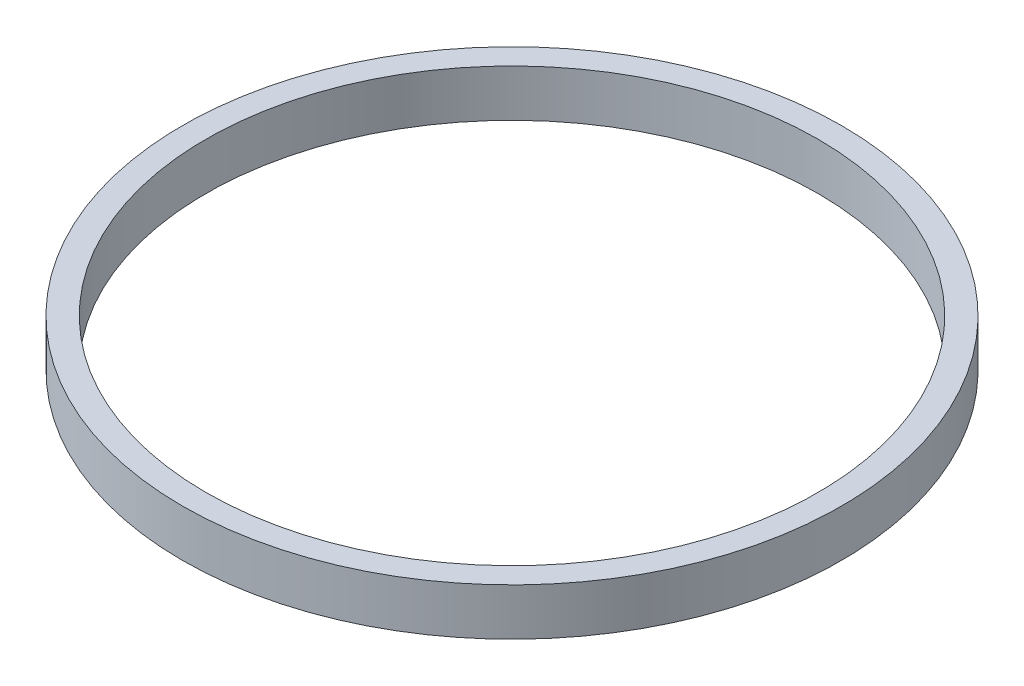
ISO-10303-21;
HEADER;
FILE_DESCRIPTION(('STEP AP214'),'2;1');
FILE_NAME('part.step','',(''),(''),'','','');
FILE_SCHEMA(('AUTOMOTIVE_DESIGN { 1 0 10303 214 1 1 1 1 }'));
ENDSEC;
DATA;
#1=APPLICATION_CONTEXT('core data for automotive mechanical design processes');
#2=APPLICATION_PROTOCOL_DEFINITION('international standard','automotive_design',2000,#1);
#3=PRODUCT_CONTEXT('',#1,'mechanical');
#4=PRODUCT('Part','Part','',(#3));
#5=PRODUCT_RELATED_PRODUCT_CATEGORY('part','',(#4));
#6=PRODUCT_DEFINITION_FORMATION('','',#4);
#7=PRODUCT_DEFINITION_CONTEXT('part definition',#1,'design');
#8=PRODUCT_DEFINITION('design','',#6,#7);
#9=PRODUCT_DEFINITION_SHAPE('','',#8);
#10=(LENGTH_UNIT() NAMED_UNIT(*) SI_UNIT(.MILLI.,.METRE.));
#11=(NAMED_UNIT(*) PLANE_ANGLE_UNIT() SI_UNIT($,.RADIAN.));
#12=(NAMED_UNIT(*) SI_UNIT($,.STERADIAN.) SOLID_ANGLE_UNIT());
#13=UNCERTAINTY_MEASURE_WITH_UNIT(LENGTH_MEASURE(1.E-05),#10,'distance_accuracy_value','');
#14=(GEOMETRIC_REPRESENTATION_CONTEXT(3) GLOBAL_UNCERTAINTY_ASSIGNED_CONTEXT((#13)) GLOBAL_UNIT_ASSIGNED_CONTEXT((#10,
#11,#12)) REPRESENTATION_CONTEXT('',''));
#15=CARTESIAN_POINT('',(0.,0.,0.));
#16=DIRECTION('',(0.,0.,1.));
#17=DIRECTION('',(1.,0.,0.));
#18=AXIS2_PLACEMENT_3D('',#15,#16,#17);
#19=CARTESIAN_POINT('',(0.,10.,0.));
#20=DIRECTION('',(0.,1.,0.));
#21=DIRECTION('',(0.,0.,1.));
#22=AXIS2_PLACEMENT_3D('',#19,#20,#21);
#23=PLANE('',#22);
#24=CARTESIAN_POINT('',(0.,10.,0.));
#25=DIRECTION('',(0.,1.,0.));
#26=DIRECTION('',(0.,0.,1.));
#27=AXIS2_PLACEMENT_3D('',#24,#25,#26);
#28=CIRCLE('',#27,70.);
#29=CARTESIAN_POINT('',(0.,10.,70.));
#30=VERTEX_POINT('',#29);
#31=EDGE_CURVE('E10',#30,#30,#28,.T.);
#32=ORIENTED_EDGE('',*,*,#31,.T.);
#33=EDGE_LOOP('',(#32));
#34=FACE_BOUND('',#33,.T.);
#35=CARTESIAN_POINT('',(0.,10.,0.));
#36=DIRECTION('',(0.,1.,0.));
#37=DIRECTION('',(0.,0.,1.));
#38=AXIS2_PLACEMENT_3D('',#35,#36,#37);
#39=CIRCLE('',#38,65.);
#40=CARTESIAN_POINT('',(0.,10.,65.));
#41=VERTEX_POINT('',#40);
#42=EDGE_CURVE('E42',#41,#41,#39,.T.);
#43=ORIENTED_EDGE('',*,*,#42,.F.);
#44=EDGE_LOOP('',(#43));
#45=FACE_BOUND('',#44,.T.);
#46=ADVANCED_FACE('F31',(#34,#45),#23,.T.);
#47=CARTESIAN_POINT('',(0.,0.,0.));
#48=DIRECTION('',(0.,1.,0.));
#49=DIRECTION('',(0.,0.,1.));
#50=AXIS2_PLACEMENT_3D('',#47,#48,#49);
#51=PLANE('',#50);
#52=CARTESIAN_POINT('',(0.,0.,0.));
#53=DIRECTION('',(0.,1.,0.));
#54=DIRECTION('',(0.,0.,1.));
#55=AXIS2_PLACEMENT_3D('',#52,#53,#54);
#56=CIRCLE('',#55,70.);
#57=CARTESIAN_POINT('',(0.,0.,70.));
#58=VERTEX_POINT('',#57);
#59=EDGE_CURVE('E35',#58,#58,#56,.T.);
#60=ORIENTED_EDGE('',*,*,#59,.F.);
#61=EDGE_LOOP('',(#60));
#62=FACE_BOUND('',#61,.T.);
#63=CARTESIAN_POINT('',(0.,0.,0.));
#64=DIRECTION('',(0.,1.,0.));
#65=DIRECTION('',(0.,0.,1.));
#66=AXIS2_PLACEMENT_3D('',#63,#64,#65);
#67=CIRCLE('',#66,65.);
#68=CARTESIAN_POINT('',(0.,0.,65.));
#69=VERTEX_POINT('',#68);
#70=EDGE_CURVE('E44',#69,#69,#67,.T.);
#71=ORIENTED_EDGE('',*,*,#70,.T.);
#72=EDGE_LOOP('',(#71));
#73=FACE_BOUND('',#72,.T.);
#74=ADVANCED_FACE('F54',(#62,#73),#51,.F.);
#75=CARTESIAN_POINT('',(0.,10.,0.));
#76=DIRECTION('',(0.,-1.,0.));
#77=DIRECTION('',(0.,0.,-1.));
#78=AXIS2_PLACEMENT_3D('',#75,#76,#77);
#79=CYLINDRICAL_SURFACE('',#78,70.);
#80=ORIENTED_EDGE('',*,*,#31,.F.);
#81=EDGE_LOOP('',(#80));
#82=FACE_BOUND('',#81,.T.);
#83=ORIENTED_EDGE('',*,*,#59,.T.);
#84=EDGE_LOOP('',(#83));
#85=FACE_BOUND('',#84,.T.);
#86=ADVANCED_FACE('F33',(#82,#85),#79,.T.);
#87=CARTESIAN_POINT('',(0.,10.,0.));
#88=DIRECTION('',(0.,-1.,0.));
#89=DIRECTION('',(0.,0.,-1.));
#90=AXIS2_PLACEMENT_3D('',#87,#88,#89);
#91=CYLINDRICAL_SURFACE('',#90,65.);
#92=ORIENTED_EDGE('',*,*,#42,.T.);
#93=EDGE_LOOP('',(#92));
#94=FACE_BOUND('',#93,.T.);
#95=ORIENTED_EDGE('',*,*,#70,.F.);
#96=EDGE_LOOP('',(#95));
#97=FACE_BOUND('',#96,.T.);
#98=ADVANCED_FACE('F50',(#94,#97),#91,.F.);
#99=CLOSED_SHELL('',(#46,#74,#86,#98));
#100=MANIFOLD_SOLID_BREP('B2',#99);
#101=ADVANCED_BREP_SHAPE_REPRESENTATION('',(#18,#100),#14);
#102=SHAPE_DEFINITION_REPRESENTATION(#9,#101);
ENDSEC;
END-ISO-10303-21;
